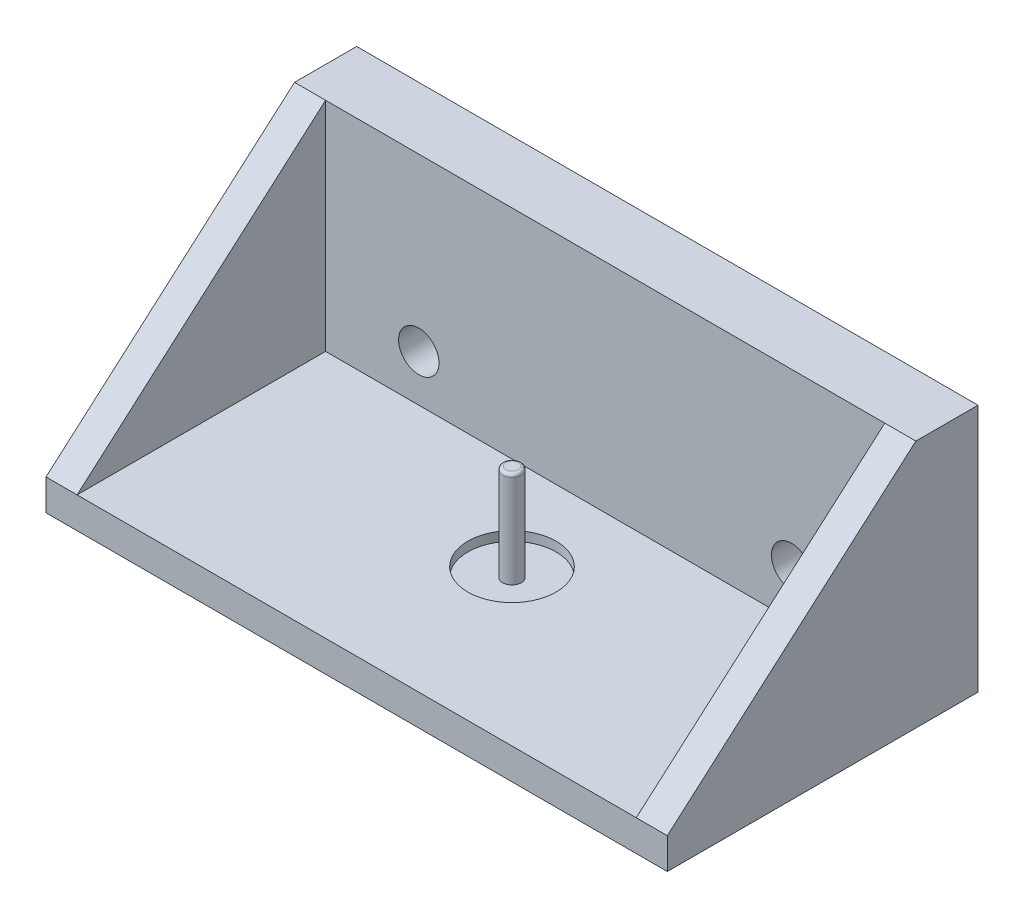
ISO-10303-21;
HEADER;
FILE_DESCRIPTION(('STEP AP214'),'2;1');
FILE_NAME('part.step','',(''),(''),'','','');
FILE_SCHEMA(('AUTOMOTIVE_DESIGN { 1 0 10303 214 1 1 1 1 }'));
ENDSEC;
DATA;
#1=APPLICATION_CONTEXT('core data for automotive mechanical design processes');
#2=APPLICATION_PROTOCOL_DEFINITION('international standard','automotive_design',2000,#1);
#3=PRODUCT_CONTEXT('',#1,'mechanical');
#4=PRODUCT('Part','Part','',(#3));
#5=PRODUCT_RELATED_PRODUCT_CATEGORY('part','',(#4));
#6=PRODUCT_DEFINITION_FORMATION('','',#4);
#7=PRODUCT_DEFINITION_CONTEXT('part definition',#1,'design');
#8=PRODUCT_DEFINITION('design','',#6,#7);
#9=PRODUCT_DEFINITION_SHAPE('','',#8);
#10=(LENGTH_UNIT() NAMED_UNIT(*) SI_UNIT(.MILLI.,.METRE.));
#11=(NAMED_UNIT(*) PLANE_ANGLE_UNIT() SI_UNIT($,.RADIAN.));
#12=(NAMED_UNIT(*) SI_UNIT($,.STERADIAN.) SOLID_ANGLE_UNIT());
#13=UNCERTAINTY_MEASURE_WITH_UNIT(LENGTH_MEASURE(1.E-05),#10,'distance_accuracy_value','');
#14=(GEOMETRIC_REPRESENTATION_CONTEXT(3) GLOBAL_UNCERTAINTY_ASSIGNED_CONTEXT((#13)) GLOBAL_UNIT_ASSIGNED_CONTEXT((#10,
#11,#12)) REPRESENTATION_CONTEXT('',''));
#15=CARTESIAN_POINT('',(0.,0.,0.));
#16=DIRECTION('',(0.,0.,1.));
#17=DIRECTION('',(1.,0.,0.));
#18=AXIS2_PLACEMENT_3D('',#15,#16,#17);
#19=CARTESIAN_POINT('',(0.,5.,0.));
#20=DIRECTION('',(0.,-1.,0.));
#21=DIRECTION('',(0.,0.,-1.));
#22=AXIS2_PLACEMENT_3D('',#19,#20,#21);
#23=PLANE('',#22);
#24=CARTESIAN_POINT('',(0.,5.,0.));
#25=DIRECTION('',(0.,1.,0.));
#26=DIRECTION('',(0.,0.,1.));
#27=AXIS2_PLACEMENT_3D('',#24,#25,#26);
#28=CIRCLE('',#27,7.1);
#29=CARTESIAN_POINT('',(0.,5.,7.1));
#30=VERTEX_POINT('',#29);
#31=EDGE_CURVE('E327',#30,#30,#28,.T.);
#32=ORIENTED_EDGE('',*,*,#31,.F.);
#33=EDGE_LOOP('',(#32));
#34=FACE_BOUND('',#33,.T.);
#35=DIRECTION('',(0.,0.,1.));
#36=VECTOR('',#35,1.);
#37=CARTESIAN_POINT('',(-45.,5.,-15.));
#38=LINE('',#37,#36);
#39=CARTESIAN_POINT('',(-45.,5.,-15.));
#40=VERTEX_POINT('',#39);
#41=CARTESIAN_POINT('',(-45.,5.,25.));
#42=VERTEX_POINT('',#41);
#43=EDGE_CURVE('E108',#40,#42,#38,.T.);
#44=ORIENTED_EDGE('',*,*,#43,.T.);
#45=DIRECTION('',(1.,0.,0.));
#46=VECTOR('',#45,1.);
#47=CARTESIAN_POINT('',(-50.,5.,25.));
#48=LINE('',#47,#46);
#49=CARTESIAN_POINT('',(45.,5.,25.));
#50=VERTEX_POINT('',#49);
#51=EDGE_CURVE('E147',#42,#50,#48,.T.);
#52=ORIENTED_EDGE('',*,*,#51,.T.);
#53=DIRECTION('',(0.,0.,1.));
#54=VECTOR('',#53,1.);
#55=CARTESIAN_POINT('',(45.,5.,-15.));
#56=LINE('',#55,#54);
#57=CARTESIAN_POINT('',(45.,5.,-15.));
#58=VERTEX_POINT('',#57);
#59=EDGE_CURVE('E130',#58,#50,#56,.T.);
#60=ORIENTED_EDGE('',*,*,#59,.F.);
#61=DIRECTION('',(1.,0.,0.));
#62=VECTOR('',#61,1.);
#63=CARTESIAN_POINT('',(0.,5.,-15.));
#64=LINE('',#63,#62);
#65=EDGE_CURVE('E122',#40,#58,#64,.T.);
#66=ORIENTED_EDGE('',*,*,#65,.F.);
#67=EDGE_LOOP('',(#44,#52,#60,#66));
#68=FACE_BOUND('',#67,.T.);
#69=ADVANCED_FACE('F41',(#34,#68),#23,.F.);
#70=CARTESIAN_POINT('',(-50.,40.,-15.));
#71=DIRECTION('',(0.,0.,-1.));
#72=DIRECTION('',(-1.,0.,0.));
#73=AXIS2_PLACEMENT_3D('',#70,#71,#72);
#74=PLANE('',#73);
#75=CARTESIAN_POINT('',(30.,12.5,-15.));
#76=DIRECTION('',(0.,0.,-1.));
#77=DIRECTION('',(-1.,0.,0.));
#78=AXIS2_PLACEMENT_3D('',#75,#76,#77);
#79=CIRCLE('',#78,3.25);
#80=CARTESIAN_POINT('',(26.75,12.5,-15.));
#81=VERTEX_POINT('',#80);
#82=EDGE_CURVE('E175',#81,#81,#79,.F.);
#83=ORIENTED_EDGE('',*,*,#82,.F.);
#84=EDGE_LOOP('',(#83));
#85=FACE_BOUND('',#84,.T.);
#86=CARTESIAN_POINT('',(-30.,12.5,-15.));
#87=DIRECTION('',(0.,0.,-1.));
#88=DIRECTION('',(-1.,0.,0.));
#89=AXIS2_PLACEMENT_3D('',#86,#87,#88);
#90=CIRCLE('',#89,3.25);
#91=CARTESIAN_POINT('',(-33.25,12.5,-15.));
#92=VERTEX_POINT('',#91);
#93=EDGE_CURVE('E169',#92,#92,#90,.T.);
#94=ORIENTED_EDGE('',*,*,#93,.T.);
#95=EDGE_LOOP('',(#94));
#96=FACE_BOUND('',#95,.T.);
#97=DIRECTION('',(0.,-1.,0.));
#98=VECTOR('',#97,1.);
#99=CARTESIAN_POINT('',(-45.,40.,-15.));
#100=LINE('',#99,#98);
#101=CARTESIAN_POINT('',(-45.,40.,-15.));
#102=VERTEX_POINT('',#101);
#103=EDGE_CURVE('E111',#102,#40,#100,.T.);
#104=ORIENTED_EDGE('',*,*,#103,.T.);
#105=ORIENTED_EDGE('',*,*,#65,.T.);
#106=DIRECTION('',(0.,-1.,0.));
#107=VECTOR('',#106,1.);
#108=CARTESIAN_POINT('',(45.,40.,-15.));
#109=LINE('',#108,#107);
#110=CARTESIAN_POINT('',(45.,40.,-15.));
#111=VERTEX_POINT('',#110);
#112=EDGE_CURVE('E264',#111,#58,#109,.T.);
#113=ORIENTED_EDGE('',*,*,#112,.F.);
#114=DIRECTION('',(1.,0.,0.));
#115=VECTOR('',#114,1.);
#116=CARTESIAN_POINT('',(-50.,40.,-15.));
#117=LINE('',#116,#115);
#118=EDGE_CURVE('E124',#102,#111,#117,.T.);
#119=ORIENTED_EDGE('',*,*,#118,.F.);
#120=EDGE_LOOP('',(#104,#105,#113,#119));
#121=FACE_BOUND('',#120,.T.);
#122=ADVANCED_FACE('F120',(#85,#96,#121),#74,.F.);
#123=CARTESIAN_POINT('',(50.,5.,25.));
#124=DIRECTION('',(-1.,0.,0.));
#125=DIRECTION('',(0.,0.,1.));
#126=AXIS2_PLACEMENT_3D('',#123,#124,#125);
#127=PLANE('',#126);
#128=DIRECTION('',(0.,-1.,0.));
#129=VECTOR('',#128,1.);
#130=CARTESIAN_POINT('',(50.,5.,-25.));
#131=LINE('',#130,#129);
#132=CARTESIAN_POINT('',(50.,40.,-25.));
#133=VERTEX_POINT('',#132);
#134=CARTESIAN_POINT('',(50.,0.,-25.));
#135=VERTEX_POINT('',#134);
#136=EDGE_CURVE('E165',#133,#135,#131,.T.);
#137=ORIENTED_EDGE('',*,*,#136,.F.);
#138=DIRECTION('',(0.,0.,-1.));
#139=VECTOR('',#138,1.);
#140=CARTESIAN_POINT('',(50.,40.,-25.));
#141=LINE('',#140,#139);
#142=CARTESIAN_POINT('',(50.,40.,-15.));
#143=VERTEX_POINT('',#142);
#144=EDGE_CURVE('E140',#143,#133,#141,.T.);
#145=ORIENTED_EDGE('',*,*,#144,.F.);
#146=DIRECTION('',(0.,0.658504607868518,-0.752576694706878));
#147=VECTOR('',#146,1.);
#148=CARTESIAN_POINT('',(50.,5.,25.));
#149=LINE('',#148,#147);
#150=CARTESIAN_POINT('',(50.,5.,25.));
#151=VERTEX_POINT('',#150);
#152=EDGE_CURVE('E268',#151,#143,#149,.T.);
#153=ORIENTED_EDGE('',*,*,#152,.F.);
#154=DIRECTION('',(0.,-1.,0.));
#155=VECTOR('',#154,1.);
#156=CARTESIAN_POINT('',(50.,5.,25.));
#157=LINE('',#156,#155);
#158=CARTESIAN_POINT('',(50.,0.,25.));
#159=VERTEX_POINT('',#158);
#160=EDGE_CURVE('E146',#151,#159,#157,.T.);
#161=ORIENTED_EDGE('',*,*,#160,.T.);
#162=DIRECTION('',(0.,0.,-1.));
#163=VECTOR('',#162,1.);
#164=CARTESIAN_POINT('',(50.,0.,25.));
#165=LINE('',#164,#163);
#166=EDGE_CURVE('E132',#159,#135,#165,.T.);
#167=ORIENTED_EDGE('',*,*,#166,.T.);
#168=EDGE_LOOP('',(#137,#145,#153,#161,#167));
#169=FACE_BOUND('',#168,.T.);
#170=ADVANCED_FACE('F199',(#169),#127,.F.);
#171=CARTESIAN_POINT('',(-50.,5.,-25.));
#172=DIRECTION('',(0.,0.,1.));
#173=DIRECTION('',(1.,0.,0.));
#174=AXIS2_PLACEMENT_3D('',#171,#172,#173);
#175=PLANE('',#174);
#176=CARTESIAN_POINT('',(30.,12.5,-25.));
#177=DIRECTION('',(0.,0.,-1.));
#178=DIRECTION('',(-1.,0.,0.));
#179=AXIS2_PLACEMENT_3D('',#176,#177,#178);
#180=CIRCLE('',#179,3.25);
#181=CARTESIAN_POINT('',(26.75,12.5,-25.));
#182=VERTEX_POINT('',#181);
#183=EDGE_CURVE('E178',#182,#182,#180,.T.);
#184=ORIENTED_EDGE('',*,*,#183,.F.);
#185=EDGE_LOOP('',(#184));
#186=FACE_BOUND('',#185,.T.);
#187=CARTESIAN_POINT('',(-30.,12.5,-25.));
#188=DIRECTION('',(0.,0.,1.));
#189=DIRECTION('',(1.,0.,0.));
#190=AXIS2_PLACEMENT_3D('',#187,#188,#189);
#191=CIRCLE('',#190,3.25);
#192=CARTESIAN_POINT('',(-26.75,12.5,-25.));
#193=VERTEX_POINT('',#192);
#194=EDGE_CURVE('E174',#193,#193,#191,.T.);
#195=ORIENTED_EDGE('',*,*,#194,.T.);
#196=EDGE_LOOP('',(#195));
#197=FACE_BOUND('',#196,.T.);
#198=DIRECTION('',(-1.,0.,0.));
#199=VECTOR('',#198,1.);
#200=CARTESIAN_POINT('',(-50.,0.,-25.));
#201=LINE('',#200,#199);
#202=CARTESIAN_POINT('',(-50.,0.,-25.));
#203=VERTEX_POINT('',#202);
#204=EDGE_CURVE('E137',#135,#203,#201,.T.);
#205=ORIENTED_EDGE('',*,*,#204,.T.);
#206=DIRECTION('',(0.,-1.,0.));
#207=VECTOR('',#206,1.);
#208=CARTESIAN_POINT('',(-50.,5.,-25.));
#209=LINE('',#208,#207);
#210=CARTESIAN_POINT('',(-50.,40.,-25.));
#211=VERTEX_POINT('',#210);
#212=EDGE_CURVE('E161',#211,#203,#209,.T.);
#213=ORIENTED_EDGE('',*,*,#212,.F.);
#214=DIRECTION('',(-1.,0.,0.));
#215=VECTOR('',#214,1.);
#216=CARTESIAN_POINT('',(-50.,40.,-25.));
#217=LINE('',#216,#215);
#218=EDGE_CURVE('E133',#133,#211,#217,.T.);
#219=ORIENTED_EDGE('',*,*,#218,.F.);
#220=ORIENTED_EDGE('',*,*,#136,.T.);
#221=EDGE_LOOP('',(#205,#213,#219,#220));
#222=FACE_BOUND('',#221,.T.);
#223=ADVANCED_FACE('F216',(#186,#197,#222),#175,.F.);
#224=CARTESIAN_POINT('',(-50.,5.,25.));
#225=DIRECTION('',(1.,0.,0.));
#226=DIRECTION('',(0.,0.,-1.));
#227=AXIS2_PLACEMENT_3D('',#224,#225,#226);
#228=PLANE('',#227);
#229=DIRECTION('',(0.,-1.,0.));
#230=VECTOR('',#229,1.);
#231=CARTESIAN_POINT('',(-50.,5.,25.));
#232=LINE('',#231,#230);
#233=CARTESIAN_POINT('',(-50.,5.,25.));
#234=VERTEX_POINT('',#233);
#235=CARTESIAN_POINT('',(-50.,0.,25.));
#236=VERTEX_POINT('',#235);
#237=EDGE_CURVE('E158',#234,#236,#232,.T.);
#238=ORIENTED_EDGE('',*,*,#237,.F.);
#239=DIRECTION('',(0.,0.658504607868518,-0.752576694706878));
#240=VECTOR('',#239,1.);
#241=CARTESIAN_POINT('',(-50.,5.,25.));
#242=LINE('',#241,#240);
#243=CARTESIAN_POINT('',(-50.,40.,-15.));
#244=VERTEX_POINT('',#243);
#245=EDGE_CURVE('E117',#234,#244,#242,.T.);
#246=ORIENTED_EDGE('',*,*,#245,.T.);
#247=DIRECTION('',(0.,0.,1.));
#248=VECTOR('',#247,1.);
#249=CARTESIAN_POINT('',(-50.,40.,-25.));
#250=LINE('',#249,#248);
#251=EDGE_CURVE('E173',#211,#244,#250,.T.);
#252=ORIENTED_EDGE('',*,*,#251,.F.);
#253=ORIENTED_EDGE('',*,*,#212,.T.);
#254=DIRECTION('',(0.,0.,1.));
#255=VECTOR('',#254,1.);
#256=CARTESIAN_POINT('',(-50.,0.,25.));
#257=LINE('',#256,#255);
#258=EDGE_CURVE('E151',#203,#236,#257,.T.);
#259=ORIENTED_EDGE('',*,*,#258,.T.);
#260=EDGE_LOOP('',(#238,#246,#252,#253,#259));
#261=FACE_BOUND('',#260,.T.);
#262=ADVANCED_FACE('F213',(#261),#228,.F.);
#263=CARTESIAN_POINT('',(-50.,5.,25.));
#264=DIRECTION('',(0.,0.,-1.));
#265=DIRECTION('',(-1.,0.,0.));
#266=AXIS2_PLACEMENT_3D('',#263,#264,#265);
#267=PLANE('',#266);
#268=DIRECTION('',(1.,0.,0.));
#269=VECTOR('',#268,1.);
#270=CARTESIAN_POINT('',(-50.,0.,25.));
#271=LINE('',#270,#269);
#272=EDGE_CURVE('E65',#236,#159,#271,.T.);
#273=ORIENTED_EDGE('',*,*,#272,.T.);
#274=ORIENTED_EDGE('',*,*,#160,.F.);
#275=DIRECTION('',(1.,0.,0.));
#276=VECTOR('',#275,1.);
#277=CARTESIAN_POINT('',(45.,5.,25.));
#278=LINE('',#277,#276);
#279=EDGE_CURVE('E256',#50,#151,#278,.T.);
#280=ORIENTED_EDGE('',*,*,#279,.F.);
#281=ORIENTED_EDGE('',*,*,#51,.F.);
#282=EDGE_CURVE('E144',#234,#42,#48,.T.);
#283=ORIENTED_EDGE('',*,*,#282,.F.);
#284=ORIENTED_EDGE('',*,*,#237,.T.);
#285=EDGE_LOOP('',(#273,#274,#280,#281,#283,#284));
#286=FACE_BOUND('',#285,.T.);
#287=ADVANCED_FACE('F209',(#286),#267,.F.);
#288=CARTESIAN_POINT('',(0.,0.,0.));
#289=DIRECTION('',(0.,-1.,0.));
#290=DIRECTION('',(0.,0.,-1.));
#291=AXIS2_PLACEMENT_3D('',#288,#289,#290);
#292=PLANE('',#291);
#293=ORIENTED_EDGE('',*,*,#204,.F.);
#294=ORIENTED_EDGE('',*,*,#166,.F.);
#295=ORIENTED_EDGE('',*,*,#272,.F.);
#296=ORIENTED_EDGE('',*,*,#258,.F.);
#297=EDGE_LOOP('',(#293,#294,#295,#296));
#298=FACE_BOUND('',#297,.T.);
#299=ADVANCED_FACE('F205',(#298),#292,.T.);
#300=CARTESIAN_POINT('',(0.,40.,0.));
#301=DIRECTION('',(0.,1.,0.));
#302=DIRECTION('',(0.,0.,1.));
#303=AXIS2_PLACEMENT_3D('',#300,#301,#302);
#304=PLANE('',#303);
#305=ORIENTED_EDGE('',*,*,#251,.T.);
#306=EDGE_CURVE('E237',#244,#102,#117,.T.);
#307=ORIENTED_EDGE('',*,*,#306,.T.);
#308=ORIENTED_EDGE('',*,*,#118,.T.);
#309=DIRECTION('',(1.,0.,0.));
#310=VECTOR('',#309,1.);
#311=CARTESIAN_POINT('',(45.,40.,-15.));
#312=LINE('',#311,#310);
#313=EDGE_CURVE('E235',#111,#143,#312,.T.);
#314=ORIENTED_EDGE('',*,*,#313,.T.);
#315=ORIENTED_EDGE('',*,*,#144,.T.);
#316=ORIENTED_EDGE('',*,*,#218,.T.);
#317=EDGE_LOOP('',(#305,#307,#308,#314,#315,#316));
#318=FACE_BOUND('',#317,.T.);
#319=ADVANCED_FACE('F208',(#318),#304,.T.);
#320=CARTESIAN_POINT('',(-30.,12.5,-25.));
#321=DIRECTION('',(0.,0.,1.));
#322=DIRECTION('',(1.,0.,0.));
#323=AXIS2_PLACEMENT_3D('',#320,#321,#322);
#324=CYLINDRICAL_SURFACE('',#323,3.25);
#325=ORIENTED_EDGE('',*,*,#194,.F.);
#326=EDGE_LOOP('',(#325));
#327=FACE_BOUND('',#326,.T.);
#328=ORIENTED_EDGE('',*,*,#93,.F.);
#329=EDGE_LOOP('',(#328));
#330=FACE_BOUND('',#329,.T.);
#331=ADVANCED_FACE('F290',(#327,#330),#324,.F.);
#332=CARTESIAN_POINT('',(30.,12.5,-25.));
#333=DIRECTION('',(0.,0.,1.));
#334=DIRECTION('',(1.,0.,0.));
#335=AXIS2_PLACEMENT_3D('',#332,#333,#334);
#336=CYLINDRICAL_SURFACE('',#335,3.25);
#337=ORIENTED_EDGE('',*,*,#183,.T.);
#338=EDGE_LOOP('',(#337));
#339=FACE_BOUND('',#338,.T.);
#340=ORIENTED_EDGE('',*,*,#82,.T.);
#341=EDGE_LOOP('',(#340));
#342=FACE_BOUND('',#341,.T.);
#343=ADVANCED_FACE('F283',(#339,#342),#336,.F.);
#344=CARTESIAN_POINT('',(45.,5.,25.));
#345=DIRECTION('',(0.,-0.752576694706878,-0.658504607868518));
#346=DIRECTION('',(0.,0.658504607868518,-0.752576694706878));
#347=AXIS2_PLACEMENT_3D('',#344,#345,#346);
#348=PLANE('',#347);
#349=ORIENTED_EDGE('',*,*,#152,.T.);
#350=ORIENTED_EDGE('',*,*,#313,.F.);
#351=DIRECTION('',(0.,0.658504607868518,-0.752576694706878));
#352=VECTOR('',#351,1.);
#353=CARTESIAN_POINT('',(45.,5.,25.));
#354=LINE('',#353,#352);
#355=EDGE_CURVE('E260',#50,#111,#354,.T.);
#356=ORIENTED_EDGE('',*,*,#355,.F.);
#357=ORIENTED_EDGE('',*,*,#279,.T.);
#358=EDGE_LOOP('',(#349,#350,#356,#357));
#359=FACE_BOUND('',#358,.T.);
#360=ADVANCED_FACE('F261',(#359),#348,.F.);
#361=CARTESIAN_POINT('',(45.,0.,0.));
#362=DIRECTION('',(1.,0.,0.));
#363=DIRECTION('',(0.,0.,-1.));
#364=AXIS2_PLACEMENT_3D('',#361,#362,#363);
#365=PLANE('',#364);
#366=ORIENTED_EDGE('',*,*,#59,.T.);
#367=ORIENTED_EDGE('',*,*,#355,.T.);
#368=ORIENTED_EDGE('',*,*,#112,.T.);
#369=EDGE_LOOP('',(#366,#367,#368));
#370=FACE_BOUND('',#369,.T.);
#371=ADVANCED_FACE('F266',(#370),#365,.F.);
#372=CARTESIAN_POINT('',(-45.,5.,25.));
#373=DIRECTION('',(0.,0.752576694706878,0.658504607868518));
#374=DIRECTION('',(0.,-0.658504607868518,0.752576694706878));
#375=AXIS2_PLACEMENT_3D('',#372,#373,#374);
#376=PLANE('',#375);
#377=ORIENTED_EDGE('',*,*,#245,.F.);
#378=ORIENTED_EDGE('',*,*,#282,.T.);
#379=DIRECTION('',(0.,0.658504607868518,-0.752576694706878));
#380=VECTOR('',#379,1.);
#381=CARTESIAN_POINT('',(-45.,5.,25.));
#382=LINE('',#381,#380);
#383=EDGE_CURVE('E57',#42,#102,#382,.T.);
#384=ORIENTED_EDGE('',*,*,#383,.T.);
#385=ORIENTED_EDGE('',*,*,#306,.F.);
#386=EDGE_LOOP('',(#377,#378,#384,#385));
#387=FACE_BOUND('',#386,.T.);
#388=ADVANCED_FACE('F249',(#387),#376,.T.);
#389=CARTESIAN_POINT('',(-45.,0.,0.));
#390=DIRECTION('',(-1.,0.,0.));
#391=DIRECTION('',(0.,0.,-1.));
#392=AXIS2_PLACEMENT_3D('',#389,#390,#391);
#393=PLANE('',#392);
#394=ORIENTED_EDGE('',*,*,#43,.F.);
#395=ORIENTED_EDGE('',*,*,#103,.F.);
#396=ORIENTED_EDGE('',*,*,#383,.F.);
#397=EDGE_LOOP('',(#394,#395,#396));
#398=FACE_BOUND('',#397,.T.);
#399=ADVANCED_FACE('F110',(#398),#393,.F.);
#400=CARTESIAN_POINT('',(0.,3.5,0.));
#401=DIRECTION('',(0.,1.,0.));
#402=DIRECTION('',(0.,0.,1.));
#403=AXIS2_PLACEMENT_3D('',#400,#401,#402);
#404=CYLINDRICAL_SURFACE('',#403,7.1);
#405=CARTESIAN_POINT('',(0.,3.5,0.));
#406=DIRECTION('',(0.,1.,0.));
#407=DIRECTION('',(0.,0.,1.));
#408=AXIS2_PLACEMENT_3D('',#405,#406,#407);
#409=CIRCLE('',#408,7.1);
#410=CARTESIAN_POINT('',(0.,3.5,7.1));
#411=VERTEX_POINT('',#410);
#412=EDGE_CURVE('E252',#411,#411,#409,.T.);
#413=ORIENTED_EDGE('',*,*,#412,.F.);
#414=EDGE_LOOP('',(#413));
#415=FACE_BOUND('',#414,.T.);
#416=ORIENTED_EDGE('',*,*,#31,.T.);
#417=EDGE_LOOP('',(#416));
#418=FACE_BOUND('',#417,.T.);
#419=ADVANCED_FACE('F310',(#415,#418),#404,.F.);
#420=CARTESIAN_POINT('',(0.,3.5,0.));
#421=DIRECTION('',(0.,1.,0.));
#422=DIRECTION('',(0.,0.,1.));
#423=AXIS2_PLACEMENT_3D('',#420,#421,#422);
#424=PLANE('',#423);
#425=CARTESIAN_POINT('',(0.,3.5,0.));
#426=DIRECTION('',(0.,1.,0.));
#427=DIRECTION('',(0.,0.,1.));
#428=AXIS2_PLACEMENT_3D('',#425,#426,#427);
#429=CIRCLE('',#428,1.5);
#430=CARTESIAN_POINT('',(0.,3.5,1.5));
#431=VERTEX_POINT('',#430);
#432=EDGE_CURVE('E325',#431,#431,#429,.T.);
#433=ORIENTED_EDGE('',*,*,#432,.F.);
#434=EDGE_LOOP('',(#433));
#435=FACE_BOUND('',#434,.T.);
#436=ORIENTED_EDGE('',*,*,#412,.T.);
#437=EDGE_LOOP('',(#436));
#438=FACE_BOUND('',#437,.T.);
#439=ADVANCED_FACE('F313',(#435,#438),#424,.T.);
#440=CARTESIAN_POINT('',(0.,19.,0.));
#441=DIRECTION('',(0.,-1.,0.));
#442=DIRECTION('',(0.,0.,-1.));
#443=AXIS2_PLACEMENT_3D('',#440,#441,#442);
#444=CYLINDRICAL_SURFACE('',#443,1.5);
#445=CARTESIAN_POINT('',(0.,18.5,0.));
#446=DIRECTION('',(0.,1.,0.));
#447=DIRECTION('',(0.,0.,1.));
#448=AXIS2_PLACEMENT_3D('',#445,#446,#447);
#449=CIRCLE('',#448,1.5);
#450=CARTESIAN_POINT('',(0.,18.5,1.5));
#451=VERTEX_POINT('',#450);
#452=EDGE_CURVE('E11',#451,#451,#449,.F.);
#453=ORIENTED_EDGE('',*,*,#452,.T.);
#454=EDGE_LOOP('',(#453));
#455=FACE_BOUND('',#454,.T.);
#456=ORIENTED_EDGE('',*,*,#432,.T.);
#457=EDGE_LOOP('',(#456));
#458=FACE_BOUND('',#457,.T.);
#459=ADVANCED_FACE('F190',(#455,#458),#444,.T.);
#460=CARTESIAN_POINT('',(0.,19.,0.));
#461=DIRECTION('',(0.,1.,0.));
#462=DIRECTION('',(0.,0.,1.));
#463=AXIS2_PLACEMENT_3D('',#460,#461,#462);
#464=PLANE('',#463);
#465=CARTESIAN_POINT('',(0.,19.,0.));
#466=DIRECTION('',(0.,1.,0.));
#467=DIRECTION('',(0.,0.,1.));
#468=AXIS2_PLACEMENT_3D('',#465,#466,#467);
#469=CIRCLE('',#468,1.);
#470=CARTESIAN_POINT('',(0.,19.,1.));
#471=VERTEX_POINT('',#470);
#472=EDGE_CURVE('E50',#471,#471,#469,.T.);
#473=ORIENTED_EDGE('',*,*,#472,.T.);
#474=EDGE_LOOP('',(#473));
#475=FACE_BOUND('',#474,.T.);
#476=ADVANCED_FACE('F183',(#475),#464,.T.);
#477=CARTESIAN_POINT('',(0.,18.5,0.));
#478=DIRECTION('',(0.,1.,0.));
#479=DIRECTION('',(0.,0.,1.));
#480=AXIS2_PLACEMENT_3D('',#477,#478,#479);
#481=TOROIDAL_SURFACE('',#480,1.,0.5);
#482=ORIENTED_EDGE('',*,*,#452,.F.);
#483=EDGE_LOOP('',(#482));
#484=FACE_BOUND('',#483,.T.);
#485=ORIENTED_EDGE('',*,*,#472,.F.);
#486=EDGE_LOOP('',(#485));
#487=FACE_BOUND('',#486,.T.);
#488=ADVANCED_FACE('F43',(#484,#487),#481,.T.);
#489=CLOSED_SHELL('',(#69,#122,#170,#223,#262,#287,#299,#319,#331,#343,#360,#371,#388,#399,#419,
#439,#459,#476,#488));
#490=MANIFOLD_SOLID_BREP('B2',#489);
#491=ADVANCED_BREP_SHAPE_REPRESENTATION('',(#18,#490),#14);
#492=SHAPE_DEFINITION_REPRESENTATION(#9,#491);
ENDSEC;
END-ISO-10303-21;
